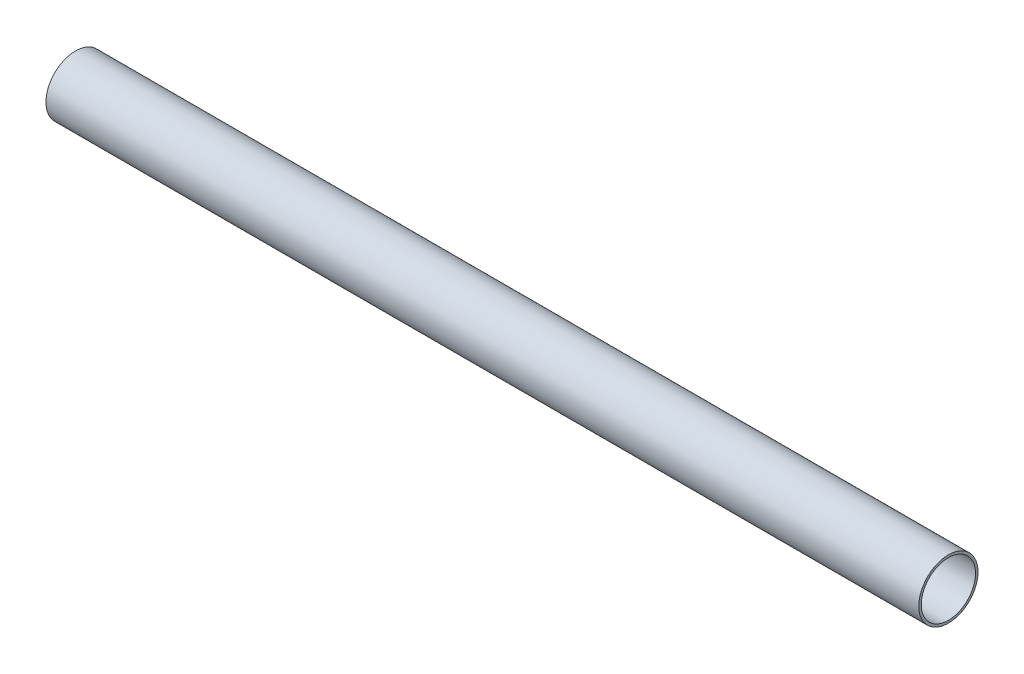
ISO-10303-21;
HEADER;
FILE_DESCRIPTION(('STEP AP214'),'2;1');
FILE_NAME('part.step','',(''),(''),'','','');
FILE_SCHEMA(('AUTOMOTIVE_DESIGN { 1 0 10303 214 1 1 1 1 }'));
ENDSEC;
DATA;
#1=APPLICATION_CONTEXT('core data for automotive mechanical design processes');
#2=APPLICATION_PROTOCOL_DEFINITION('international standard','automotive_design',2000,#1);
#3=PRODUCT_CONTEXT('',#1,'mechanical');
#4=PRODUCT('Part','Part','',(#3));
#5=PRODUCT_RELATED_PRODUCT_CATEGORY('part','',(#4));
#6=PRODUCT_DEFINITION_FORMATION('','',#4);
#7=PRODUCT_DEFINITION_CONTEXT('part definition',#1,'design');
#8=PRODUCT_DEFINITION('design','',#6,#7);
#9=PRODUCT_DEFINITION_SHAPE('','',#8);
#10=(LENGTH_UNIT() NAMED_UNIT(*) SI_UNIT(.MILLI.,.METRE.));
#11=(NAMED_UNIT(*) PLANE_ANGLE_UNIT() SI_UNIT($,.RADIAN.));
#12=(NAMED_UNIT(*) SI_UNIT($,.STERADIAN.) SOLID_ANGLE_UNIT());
#13=UNCERTAINTY_MEASURE_WITH_UNIT(LENGTH_MEASURE(1.E-05),#10,'distance_accuracy_value','');
#14=(GEOMETRIC_REPRESENTATION_CONTEXT(3) GLOBAL_UNCERTAINTY_ASSIGNED_CONTEXT((#13)) GLOBAL_UNIT_ASSIGNED_CONTEXT((#10,
#11,#12)) REPRESENTATION_CONTEXT('',''));
#15=CARTESIAN_POINT('',(0.,0.,0.));
#16=DIRECTION('',(0.,0.,1.));
#17=DIRECTION('',(1.,0.,0.));
#18=AXIS2_PLACEMENT_3D('',#15,#16,#17);
#19=CARTESIAN_POINT('',(0.,0.,0.));
#20=DIRECTION('',(1.,0.,0.));
#21=DIRECTION('',(0.,0.,-1.));
#22=AXIS2_PLACEMENT_3D('',#19,#20,#21);
#23=CYLINDRICAL_SURFACE('',#22,15.45);
#24=CARTESIAN_POINT('',(0.,0.,0.));
#25=DIRECTION('',(1.,0.,0.));
#26=DIRECTION('',(0.,0.,-1.));
#27=AXIS2_PLACEMENT_3D('',#24,#25,#26);
#28=CIRCLE('',#27,15.45);
#29=CARTESIAN_POINT('',(0.,0.,-15.45));
#30=VERTEX_POINT('',#29);
#31=EDGE_CURVE('E27',#30,#30,#28,.T.);
#32=ORIENTED_EDGE('',*,*,#31,.F.);
#33=EDGE_LOOP('',(#32));
#34=FACE_BOUND('',#33,.T.);
#35=CARTESIAN_POINT('',(496.7,0.,0.));
#36=DIRECTION('',(1.,0.,0.));
#37=DIRECTION('',(0.,0.,-1.));
#38=AXIS2_PLACEMENT_3D('',#35,#36,#37);
#39=CIRCLE('',#38,15.45);
#40=CARTESIAN_POINT('',(496.7,0.,-15.45));
#41=VERTEX_POINT('',#40);
#42=EDGE_CURVE('E18',#41,#41,#39,.T.);
#43=ORIENTED_EDGE('',*,*,#42,.T.);
#44=EDGE_LOOP('',(#43));
#45=FACE_BOUND('',#44,.T.);
#46=ADVANCED_FACE('F15',(#34,#45),#23,.F.);
#47=CARTESIAN_POINT('',(496.7,0.,0.));
#48=DIRECTION('',(-1.,0.,0.));
#49=DIRECTION('',(0.,0.,1.));
#50=AXIS2_PLACEMENT_3D('',#47,#48,#49);
#51=PLANE('',#50);
#52=ORIENTED_EDGE('',*,*,#42,.F.);
#53=EDGE_LOOP('',(#52));
#54=FACE_BOUND('',#53,.T.);
#55=CARTESIAN_POINT('',(496.7,0.,0.));
#56=DIRECTION('',(1.,0.,0.));
#57=DIRECTION('',(0.,0.,-1.));
#58=AXIS2_PLACEMENT_3D('',#55,#56,#57);
#59=CIRCLE('',#58,16.85);
#60=CARTESIAN_POINT('',(496.7,0.,-16.85));
#61=VERTEX_POINT('',#60);
#62=EDGE_CURVE('E22',#61,#61,#59,.F.);
#63=ORIENTED_EDGE('',*,*,#62,.F.);
#64=EDGE_LOOP('',(#63));
#65=FACE_BOUND('',#64,.T.);
#66=ADVANCED_FACE('F36',(#54,#65),#51,.F.);
#67=CARTESIAN_POINT('',(0.,0.,0.));
#68=DIRECTION('',(-1.,0.,0.));
#69=DIRECTION('',(0.,0.,1.));
#70=AXIS2_PLACEMENT_3D('',#67,#68,#69);
#71=PLANE('',#70);
#72=ORIENTED_EDGE('',*,*,#31,.T.);
#73=EDGE_LOOP('',(#72));
#74=FACE_BOUND('',#73,.T.);
#75=CARTESIAN_POINT('',(0.,0.,0.));
#76=DIRECTION('',(1.,0.,0.));
#77=DIRECTION('',(0.,0.,-1.));
#78=AXIS2_PLACEMENT_3D('',#75,#76,#77);
#79=CIRCLE('',#78,16.85);
#80=CARTESIAN_POINT('',(0.,0.,-16.85));
#81=VERTEX_POINT('',#80);
#82=EDGE_CURVE('E10',#81,#81,#79,.T.);
#83=ORIENTED_EDGE('',*,*,#82,.F.);
#84=EDGE_LOOP('',(#83));
#85=FACE_BOUND('',#84,.T.);
#86=ADVANCED_FACE('F39',(#74,#85),#71,.T.);
#87=CARTESIAN_POINT('',(0.,0.,0.));
#88=DIRECTION('',(1.,0.,0.));
#89=DIRECTION('',(0.,0.,-1.));
#90=AXIS2_PLACEMENT_3D('',#87,#88,#89);
#91=CYLINDRICAL_SURFACE('',#90,16.85);
#92=ORIENTED_EDGE('',*,*,#82,.T.);
#93=EDGE_LOOP('',(#92));
#94=FACE_BOUND('',#93,.T.);
#95=ORIENTED_EDGE('',*,*,#62,.T.);
#96=EDGE_LOOP('',(#95));
#97=FACE_BOUND('',#96,.T.);
#98=ADVANCED_FACE('F42',(#94,#97),#91,.T.);
#99=CLOSED_SHELL('',(#46,#66,#86,#98));
#100=MANIFOLD_SOLID_BREP('B1',#99);
#101=ADVANCED_BREP_SHAPE_REPRESENTATION('',(#18,#100),#14);
#102=SHAPE_DEFINITION_REPRESENTATION(#9,#101);
ENDSEC;
END-ISO-10303-21;
